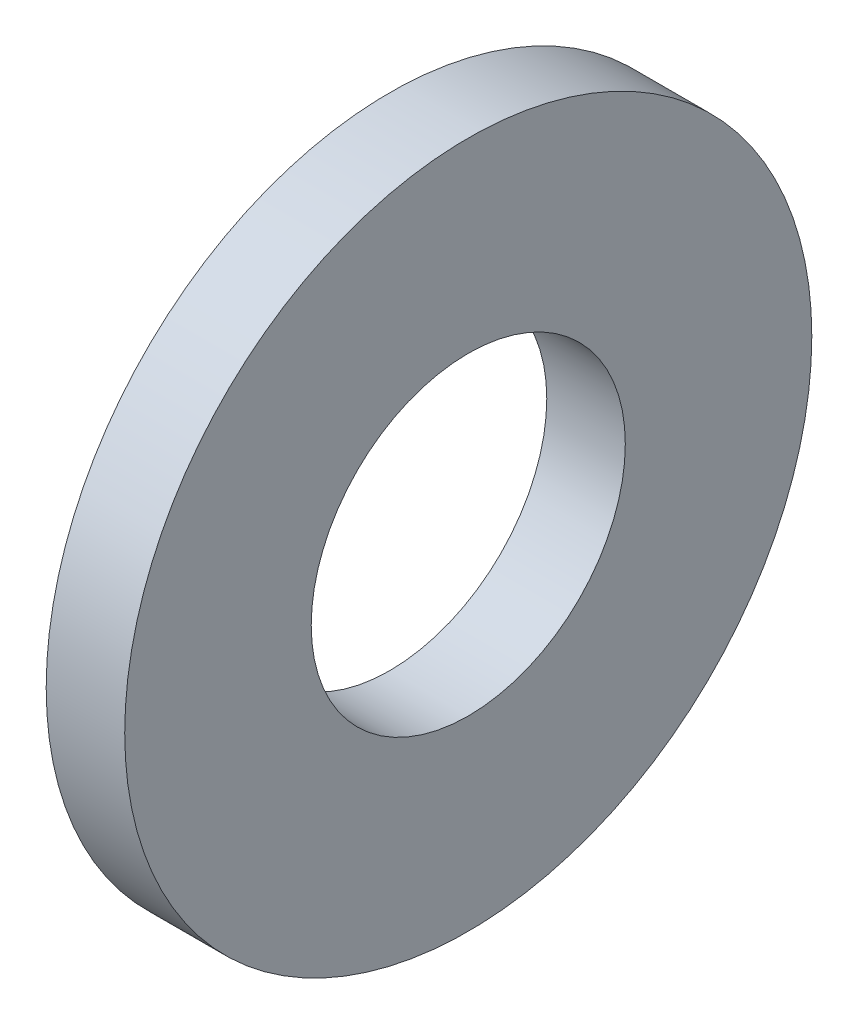
ISO-10303-21;
HEADER;
FILE_DESCRIPTION(('STEP AP214'),'2;1');
FILE_NAME('part.step','',(''),(''),'','','');
FILE_SCHEMA(('AUTOMOTIVE_DESIGN { 1 0 10303 214 1 1 1 1 }'));
ENDSEC;
DATA;
#1=APPLICATION_CONTEXT('core data for automotive mechanical design processes');
#2=APPLICATION_PROTOCOL_DEFINITION('international standard','automotive_design',2000,#1);
#3=PRODUCT_CONTEXT('',#1,'mechanical');
#4=PRODUCT('Part','Part','',(#3));
#5=PRODUCT_RELATED_PRODUCT_CATEGORY('part','',(#4));
#6=PRODUCT_DEFINITION_FORMATION('','',#4);
#7=PRODUCT_DEFINITION_CONTEXT('part definition',#1,'design');
#8=PRODUCT_DEFINITION('design','',#6,#7);
#9=PRODUCT_DEFINITION_SHAPE('','',#8);
#10=(LENGTH_UNIT() NAMED_UNIT(*) SI_UNIT(.MILLI.,.METRE.));
#11=(NAMED_UNIT(*) PLANE_ANGLE_UNIT() SI_UNIT($,.RADIAN.));
#12=(NAMED_UNIT(*) SI_UNIT($,.STERADIAN.) SOLID_ANGLE_UNIT());
#13=UNCERTAINTY_MEASURE_WITH_UNIT(LENGTH_MEASURE(1.E-05),#10,'distance_accuracy_value','');
#14=(GEOMETRIC_REPRESENTATION_CONTEXT(3) GLOBAL_UNCERTAINTY_ASSIGNED_CONTEXT((#13)) GLOBAL_UNIT_ASSIGNED_CONTEXT((#10,
#11,#12)) REPRESENTATION_CONTEXT('',''));
#15=CARTESIAN_POINT('',(0.,0.,0.));
#16=DIRECTION('',(0.,0.,1.));
#17=DIRECTION('',(1.,0.,0.));
#18=AXIS2_PLACEMENT_3D('',#15,#16,#17);
#19=CARTESIAN_POINT('',(0.8,0.,0.));
#20=DIRECTION('',(1.,0.,0.));
#21=DIRECTION('',(0.,0.,-1.));
#22=AXIS2_PLACEMENT_3D('',#19,#20,#21);
#23=PLANE('',#22);
#24=CARTESIAN_POINT('',(0.8,0.,0.));
#25=DIRECTION('',(1.,0.,0.));
#26=DIRECTION('',(0.,0.,-1.));
#27=AXIS2_PLACEMENT_3D('',#24,#25,#26);
#28=CIRCLE('',#27,3.5);
#29=CARTESIAN_POINT('',(0.8,0.,-3.5));
#30=VERTEX_POINT('',#29);
#31=EDGE_CURVE('E10',#30,#30,#28,.T.);
#32=ORIENTED_EDGE('',*,*,#31,.T.);
#33=EDGE_LOOP('',(#32));
#34=FACE_BOUND('',#33,.T.);
#35=CARTESIAN_POINT('',(0.8,0.,0.));
#36=DIRECTION('',(1.,0.,0.));
#37=DIRECTION('',(0.,0.,-1.));
#38=AXIS2_PLACEMENT_3D('',#35,#36,#37);
#39=CIRCLE('',#38,1.6);
#40=CARTESIAN_POINT('',(0.8,0.,-1.6));
#41=VERTEX_POINT('',#40);
#42=EDGE_CURVE('E44',#41,#41,#39,.T.);
#43=ORIENTED_EDGE('',*,*,#42,.F.);
#44=EDGE_LOOP('',(#43));
#45=FACE_BOUND('',#44,.T.);
#46=ADVANCED_FACE('F33',(#34,#45),#23,.T.);
#47=CARTESIAN_POINT('',(0.,0.,0.));
#48=DIRECTION('',(1.,0.,0.));
#49=DIRECTION('',(0.,0.,-1.));
#50=AXIS2_PLACEMENT_3D('',#47,#48,#49);
#51=PLANE('',#50);
#52=CARTESIAN_POINT('',(0.,0.,0.));
#53=DIRECTION('',(1.,0.,0.));
#54=DIRECTION('',(0.,0.,-1.));
#55=AXIS2_PLACEMENT_3D('',#52,#53,#54);
#56=CIRCLE('',#55,3.5);
#57=CARTESIAN_POINT('',(0.,0.,-3.5));
#58=VERTEX_POINT('',#57);
#59=EDGE_CURVE('E37',#58,#58,#56,.T.);
#60=ORIENTED_EDGE('',*,*,#59,.F.);
#61=EDGE_LOOP('',(#60));
#62=FACE_BOUND('',#61,.T.);
#63=CARTESIAN_POINT('',(0.,0.,0.));
#64=DIRECTION('',(1.,0.,0.));
#65=DIRECTION('',(0.,0.,-1.));
#66=AXIS2_PLACEMENT_3D('',#63,#64,#65);
#67=CIRCLE('',#66,1.6);
#68=CARTESIAN_POINT('',(0.,0.,-1.6));
#69=VERTEX_POINT('',#68);
#70=EDGE_CURVE('E46',#69,#69,#67,.T.);
#71=ORIENTED_EDGE('',*,*,#70,.T.);
#72=EDGE_LOOP('',(#71));
#73=FACE_BOUND('',#72,.T.);
#74=ADVANCED_FACE('F56',(#62,#73),#51,.F.);
#75=CARTESIAN_POINT('',(0.8,0.,0.));
#76=DIRECTION('',(-1.,0.,0.));
#77=DIRECTION('',(0.,0.,1.));
#78=AXIS2_PLACEMENT_3D('',#75,#76,#77);
#79=CYLINDRICAL_SURFACE('',#78,3.5);
#80=ORIENTED_EDGE('',*,*,#31,.F.);
#81=EDGE_LOOP('',(#80));
#82=FACE_BOUND('',#81,.T.);
#83=ORIENTED_EDGE('',*,*,#59,.T.);
#84=EDGE_LOOP('',(#83));
#85=FACE_BOUND('',#84,.T.);
#86=ADVANCED_FACE('F35',(#82,#85),#79,.T.);
#87=CARTESIAN_POINT('',(0.8,0.,0.));
#88=DIRECTION('',(-1.,0.,0.));
#89=DIRECTION('',(0.,0.,1.));
#90=AXIS2_PLACEMENT_3D('',#87,#88,#89);
#91=CYLINDRICAL_SURFACE('',#90,1.6);
#92=ORIENTED_EDGE('',*,*,#42,.T.);
#93=EDGE_LOOP('',(#92));
#94=FACE_BOUND('',#93,.T.);
#95=ORIENTED_EDGE('',*,*,#70,.F.);
#96=EDGE_LOOP('',(#95));
#97=FACE_BOUND('',#96,.T.);
#98=ADVANCED_FACE('F52',(#94,#97),#91,.F.);
#99=CLOSED_SHELL('',(#46,#74,#86,#98));
#100=MANIFOLD_SOLID_BREP('B2',#99);
#101=ADVANCED_BREP_SHAPE_REPRESENTATION('',(#18,#100),#14);
#102=SHAPE_DEFINITION_REPRESENTATION(#9,#101);
ENDSEC;
END-ISO-10303-21;
